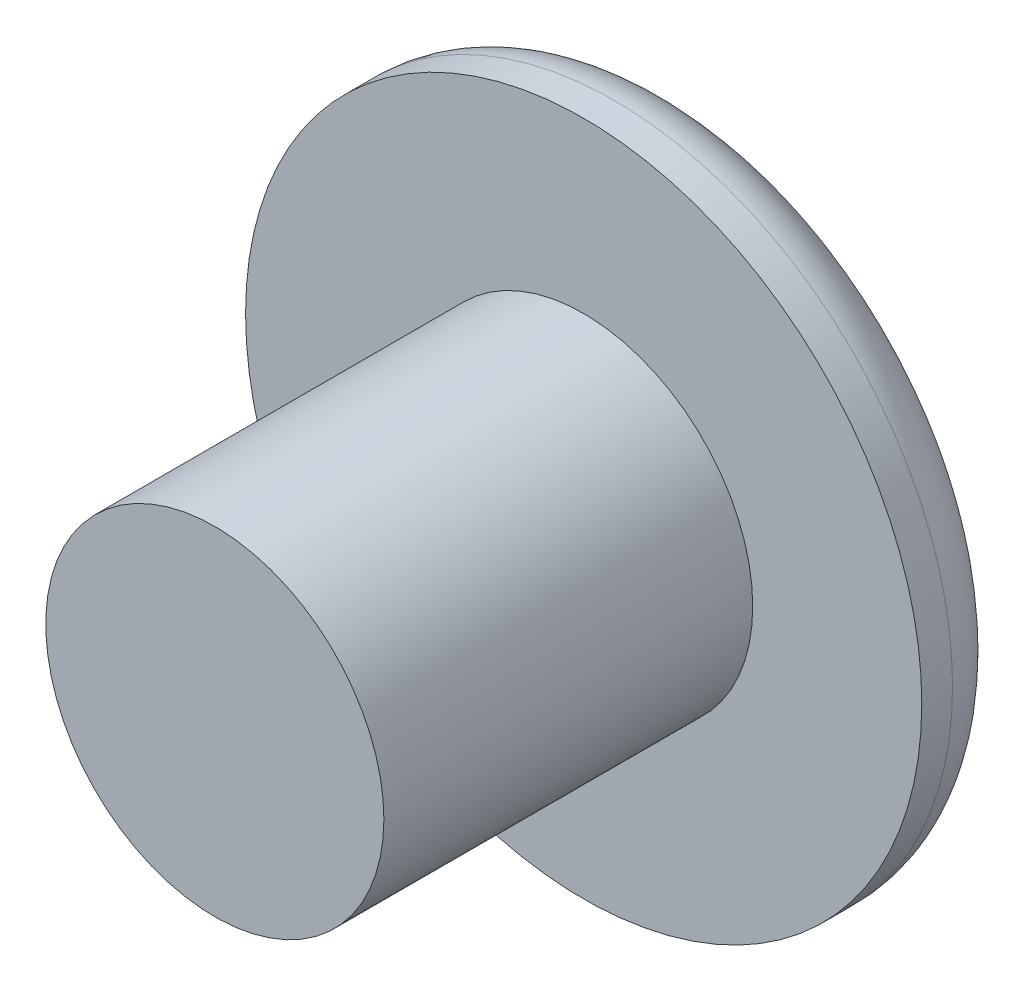
ISO-10303-21;
HEADER;
FILE_DESCRIPTION(('STEP AP214'),'2;1');
FILE_NAME('part.step','',(''),(''),'','','');
FILE_SCHEMA(('AUTOMOTIVE_DESIGN { 1 0 10303 214 1 1 1 1 }'));
ENDSEC;
DATA;
#1=APPLICATION_CONTEXT('core data for automotive mechanical design processes');
#2=APPLICATION_PROTOCOL_DEFINITION('international standard','automotive_design',2000,#1);
#3=PRODUCT_CONTEXT('',#1,'mechanical');
#4=PRODUCT('Part','Part','',(#3));
#5=PRODUCT_RELATED_PRODUCT_CATEGORY('part','',(#4));
#6=PRODUCT_DEFINITION_FORMATION('','',#4);
#7=PRODUCT_DEFINITION_CONTEXT('part definition',#1,'design');
#8=PRODUCT_DEFINITION('design','',#6,#7);
#9=PRODUCT_DEFINITION_SHAPE('','',#8);
#10=(LENGTH_UNIT() NAMED_UNIT(*) SI_UNIT(.MILLI.,.METRE.));
#11=(NAMED_UNIT(*) PLANE_ANGLE_UNIT() SI_UNIT($,.RADIAN.));
#12=(NAMED_UNIT(*) SI_UNIT($,.STERADIAN.) SOLID_ANGLE_UNIT());
#13=UNCERTAINTY_MEASURE_WITH_UNIT(LENGTH_MEASURE(1.E-05),#10,'distance_accuracy_value','');
#14=(GEOMETRIC_REPRESENTATION_CONTEXT(3) GLOBAL_UNCERTAINTY_ASSIGNED_CONTEXT((#13)) GLOBAL_UNIT_ASSIGNED_CONTEXT((#10,
#11,#12)) REPRESENTATION_CONTEXT('',''));
#15=CARTESIAN_POINT('',(0.,0.,0.));
#16=DIRECTION('',(0.,0.,1.));
#17=DIRECTION('',(1.,0.,0.));
#18=AXIS2_PLACEMENT_3D('',#15,#16,#17);
#19=CARTESIAN_POINT('',(0.,0.,12.));
#20=DIRECTION('',(0.,0.,-1.));
#21=DIRECTION('',(-1.,0.,0.));
#22=AXIS2_PLACEMENT_3D('',#19,#20,#21);
#23=CYLINDRICAL_SURFACE('',#22,5.5);
#24=CARTESIAN_POINT('',(0.,0.,0.));
#25=DIRECTION('',(0.,0.,1.));
#26=DIRECTION('',(1.,0.,0.));
#27=AXIS2_PLACEMENT_3D('',#24,#25,#26);
#28=CIRCLE('',#27,5.5);
#29=CARTESIAN_POINT('',(5.5,0.,0.));
#30=VERTEX_POINT('',#29);
#31=EDGE_CURVE('E63',#30,#30,#28,.T.);
#32=ORIENTED_EDGE('',*,*,#31,.T.);
#33=EDGE_LOOP('',(#32));
#34=FACE_BOUND('',#33,.T.);
#35=CARTESIAN_POINT('',(0.,0.,12.));
#36=DIRECTION('',(0.,0.,1.));
#37=DIRECTION('',(1.,0.,0.));
#38=AXIS2_PLACEMENT_3D('',#35,#36,#37);
#39=CIRCLE('',#38,5.5);
#40=CARTESIAN_POINT('',(5.5,0.,12.));
#41=VERTEX_POINT('',#40);
#42=EDGE_CURVE('E52',#41,#41,#39,.T.);
#43=ORIENTED_EDGE('',*,*,#42,.F.);
#44=EDGE_LOOP('',(#43));
#45=FACE_BOUND('',#44,.T.);
#46=ADVANCED_FACE('F39',(#34,#45),#23,.T.);
#47=CARTESIAN_POINT('',(0.,0.,12.));
#48=DIRECTION('',(0.,0.,1.));
#49=DIRECTION('',(1.,0.,0.));
#50=AXIS2_PLACEMENT_3D('',#47,#48,#49);
#51=PLANE('',#50);
#52=ORIENTED_EDGE('',*,*,#42,.T.);
#53=EDGE_LOOP('',(#52));
#54=FACE_BOUND('',#53,.T.);
#55=ADVANCED_FACE('F79',(#54),#51,.T.);
#56=CARTESIAN_POINT('',(0.,0.,-3.));
#57=DIRECTION('',(0.,0.,1.));
#58=DIRECTION('',(1.,0.,0.));
#59=AXIS2_PLACEMENT_3D('',#56,#57,#58);
#60=CYLINDRICAL_SURFACE('',#59,11.);
#61=CARTESIAN_POINT('',(0.,0.,-1.));
#62=DIRECTION('',(0.,0.,1.));
#63=DIRECTION('',(1.,0.,0.));
#64=AXIS2_PLACEMENT_3D('',#61,#62,#63);
#65=CIRCLE('',#64,11.);
#66=CARTESIAN_POINT('',(11.,0.,-1.));
#67=VERTEX_POINT('',#66);
#68=EDGE_CURVE('E47',#67,#67,#65,.T.);
#69=ORIENTED_EDGE('',*,*,#68,.T.);
#70=EDGE_LOOP('',(#69));
#71=FACE_BOUND('',#70,.T.);
#72=CARTESIAN_POINT('',(0.,0.,0.));
#73=DIRECTION('',(0.,0.,1.));
#74=DIRECTION('',(1.,0.,0.));
#75=AXIS2_PLACEMENT_3D('',#72,#73,#74);
#76=CIRCLE('',#75,11.);
#77=CARTESIAN_POINT('',(11.,0.,0.));
#78=VERTEX_POINT('',#77);
#79=EDGE_CURVE('E57',#78,#78,#76,.T.);
#80=ORIENTED_EDGE('',*,*,#79,.F.);
#81=EDGE_LOOP('',(#80));
#82=FACE_BOUND('',#81,.T.);
#83=ADVANCED_FACE('F74',(#71,#82),#60,.T.);
#84=CARTESIAN_POINT('',(0.,0.,0.));
#85=DIRECTION('',(0.,0.,1.));
#86=DIRECTION('',(1.,0.,0.));
#87=AXIS2_PLACEMENT_3D('',#84,#85,#86);
#88=PLANE('',#87);
#89=ORIENTED_EDGE('',*,*,#31,.F.);
#90=EDGE_LOOP('',(#89));
#91=FACE_BOUND('',#90,.T.);
#92=ORIENTED_EDGE('',*,*,#79,.T.);
#93=EDGE_LOOP('',(#92));
#94=FACE_BOUND('',#93,.T.);
#95=ADVANCED_FACE('F70',(#91,#94),#88,.T.);
#96=CARTESIAN_POINT('',(0.,0.,-3.));
#97=DIRECTION('',(0.,0.,1.));
#98=DIRECTION('',(1.,0.,0.));
#99=AXIS2_PLACEMENT_3D('',#96,#97,#98);
#100=PLANE('',#99);
#101=CARTESIAN_POINT('',(0.,0.,-3.));
#102=DIRECTION('',(0.,0.,1.));
#103=DIRECTION('',(1.,0.,0.));
#104=AXIS2_PLACEMENT_3D('',#101,#102,#103);
#105=CIRCLE('',#104,9.);
#106=CARTESIAN_POINT('',(9.,0.,-3.));
#107=VERTEX_POINT('',#106);
#108=EDGE_CURVE('E10',#107,#107,#105,.F.);
#109=ORIENTED_EDGE('',*,*,#108,.T.);
#110=EDGE_LOOP('',(#109));
#111=FACE_BOUND('',#110,.T.);
#112=ADVANCED_FACE('F73',(#111),#100,.F.);
#113=CARTESIAN_POINT('',(0.,0.,-1.));
#114=DIRECTION('',(0.,0.,1.));
#115=DIRECTION('',(1.,0.,0.));
#116=AXIS2_PLACEMENT_3D('',#113,#114,#115);
#117=TOROIDAL_SURFACE('',#116,9.,2.);
#118=ORIENTED_EDGE('',*,*,#108,.F.);
#119=EDGE_LOOP('',(#118));
#120=FACE_BOUND('',#119,.T.);
#121=ORIENTED_EDGE('',*,*,#68,.F.);
#122=EDGE_LOOP('',(#121));
#123=FACE_BOUND('',#122,.T.);
#124=ADVANCED_FACE('F41',(#120,#123),#117,.T.);
#125=CLOSED_SHELL('',(#46,#55,#83,#95,#112,#124));
#126=MANIFOLD_SOLID_BREP('B2',#125);
#127=ADVANCED_BREP_SHAPE_REPRESENTATION('',(#18,#126),#14);
#128=SHAPE_DEFINITION_REPRESENTATION(#9,#127);
ENDSEC;
END-ISO-10303-21;
